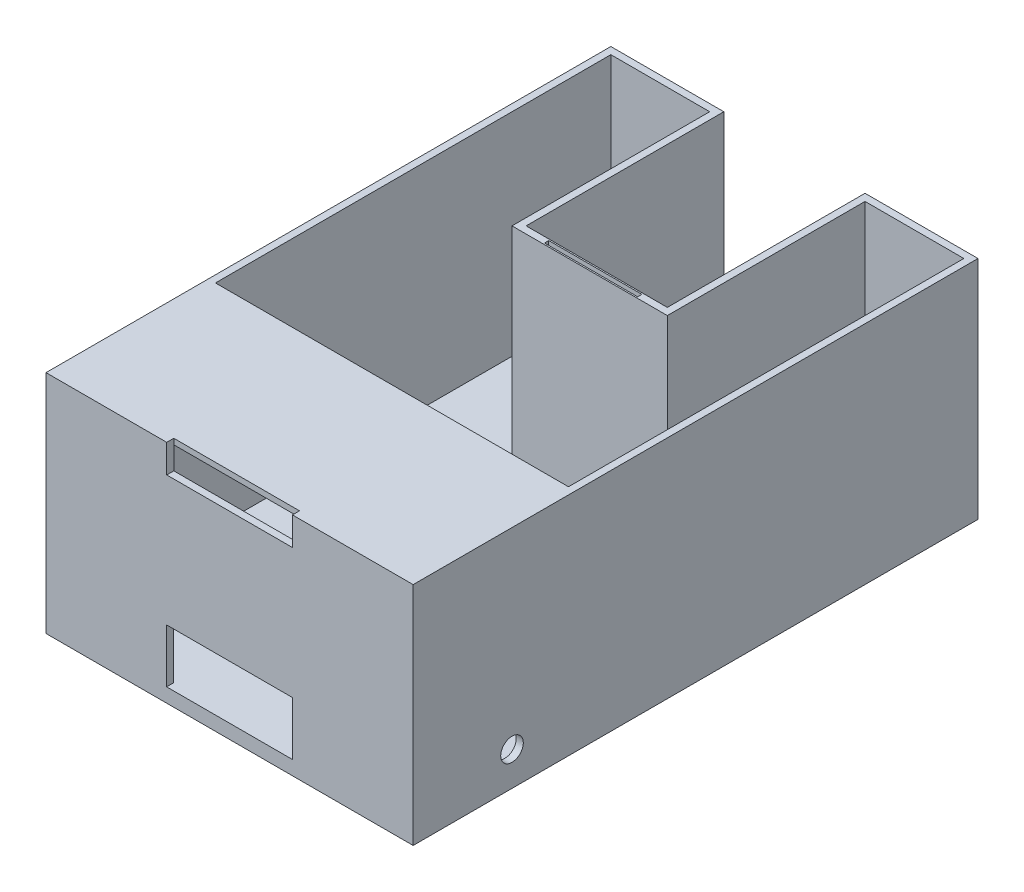
ISO-10303-21;
HEADER;
FILE_DESCRIPTION(('STEP AP214'),'2;1');
FILE_NAME('part.step','',(''),(''),'','','');
FILE_SCHEMA(('AUTOMOTIVE_DESIGN { 1 0 10303 214 1 1 1 1 }'));
ENDSEC;
DATA;
#1=APPLICATION_CONTEXT('core data for automotive mechanical design processes');
#2=APPLICATION_PROTOCOL_DEFINITION('international standard','automotive_design',2000,#1);
#3=PRODUCT_CONTEXT('',#1,'mechanical');
#4=PRODUCT('Part','Part','',(#3));
#5=PRODUCT_RELATED_PRODUCT_CATEGORY('part','',(#4));
#6=PRODUCT_DEFINITION_FORMATION('','',#4);
#7=PRODUCT_DEFINITION_CONTEXT('part definition',#1,'design');
#8=PRODUCT_DEFINITION('design','',#6,#7);
#9=PRODUCT_DEFINITION_SHAPE('','',#8);
#10=(LENGTH_UNIT() NAMED_UNIT(*) SI_UNIT(.MILLI.,.METRE.));
#11=(NAMED_UNIT(*) PLANE_ANGLE_UNIT() SI_UNIT($,.RADIAN.));
#12=(NAMED_UNIT(*) SI_UNIT($,.STERADIAN.) SOLID_ANGLE_UNIT());
#13=UNCERTAINTY_MEASURE_WITH_UNIT(LENGTH_MEASURE(1.E-05),#10,'distance_accuracy_value','');
#14=(GEOMETRIC_REPRESENTATION_CONTEXT(3) GLOBAL_UNCERTAINTY_ASSIGNED_CONTEXT((#13)) GLOBAL_UNIT_ASSIGNED_CONTEXT((#10,
#11,#12)) REPRESENTATION_CONTEXT('',''));
#15=CARTESIAN_POINT('',(0.,0.,0.));
#16=DIRECTION('',(0.,0.,1.));
#17=DIRECTION('',(1.,0.,0.));
#18=AXIS2_PLACEMENT_3D('',#15,#16,#17);
#19=CARTESIAN_POINT('',(-40.,80.,-130.));
#20=DIRECTION('',(0.,0.,-1.));
#21=DIRECTION('',(-1.,0.,0.));
#22=AXIS2_PLACEMENT_3D('',#19,#20,#21);
#23=PLANE('',#22);
#24=DIRECTION('',(0.,-1.,0.));
#25=VECTOR('',#24,1.);
#26=CARTESIAN_POINT('',(-90.,80.,-130.));
#27=LINE('',#26,#25);
#28=CARTESIAN_POINT('',(-90.,80.,-130.));
#29=VERTEX_POINT('',#28);
#30=CARTESIAN_POINT('',(-90.,-13.,-130.));
#31=VERTEX_POINT('',#30);
#32=EDGE_CURVE('E101',#29,#31,#27,.T.);
#33=ORIENTED_EDGE('',*,*,#32,.T.);
#34=DIRECTION('',(-1.,0.,0.));
#35=VECTOR('',#34,1.);
#36=CARTESIAN_POINT('',(-40.,-13.,-130.));
#37=LINE('',#36,#35);
#38=CARTESIAN_POINT('',(-40.,-13.,-130.));
#39=VERTEX_POINT('',#38);
#40=EDGE_CURVE('E12',#39,#31,#37,.T.);
#41=ORIENTED_EDGE('',*,*,#40,.F.);
#42=DIRECTION('',(0.,-1.,0.));
#43=VECTOR('',#42,1.);
#44=CARTESIAN_POINT('',(-40.,80.,-130.));
#45=LINE('',#44,#43);
#46=CARTESIAN_POINT('',(-40.,80.,-130.));
#47=VERTEX_POINT('',#46);
#48=EDGE_CURVE('E96',#47,#39,#45,.T.);
#49=ORIENTED_EDGE('',*,*,#48,.F.);
#50=DIRECTION('',(-1.,0.,0.));
#51=VECTOR('',#50,1.);
#52=CARTESIAN_POINT('',(-40.,80.,-130.));
#53=LINE('',#52,#51);
#54=EDGE_CURVE('E71',#47,#29,#53,.T.);
#55=ORIENTED_EDGE('',*,*,#54,.T.);
#56=EDGE_LOOP('',(#33,#41,#49,#55));
#57=FACE_BOUND('',#56,.T.);
#58=ADVANCED_FACE('F55',(#57),#23,.F.);
#59=CARTESIAN_POINT('',(-40.,-13.,-130.));
#60=DIRECTION('',(0.,1.,0.));
#61=DIRECTION('',(0.,0.,1.));
#62=AXIS2_PLACEMENT_3D('',#59,#60,#61);
#63=PLANE('',#62);
#64=DIRECTION('',(0.,0.,-1.));
#65=VECTOR('',#64,1.);
#66=CARTESIAN_POINT('',(-90.,-13.,-130.));
#67=LINE('',#66,#65);
#68=CARTESIAN_POINT('',(-90.,-13.,-205.609280570335));
#69=VERTEX_POINT('',#68);
#70=EDGE_CURVE('E104',#31,#69,#67,.T.);
#71=ORIENTED_EDGE('',*,*,#70,.T.);
#72=DIRECTION('',(-1.,0.,0.));
#73=VECTOR('',#72,1.);
#74=CARTESIAN_POINT('',(-40.,-13.,-205.609280570335));
#75=LINE('',#74,#73);
#76=CARTESIAN_POINT('',(-40.,-13.,-205.609280570335));
#77=VERTEX_POINT('',#76);
#78=EDGE_CURVE('E63',#77,#69,#75,.T.);
#79=ORIENTED_EDGE('',*,*,#78,.F.);
#80=DIRECTION('',(0.,0.,-1.));
#81=VECTOR('',#80,1.);
#82=CARTESIAN_POINT('',(-40.,-13.,-130.));
#83=LINE('',#82,#81);
#84=EDGE_CURVE('E89',#39,#77,#83,.T.);
#85=ORIENTED_EDGE('',*,*,#84,.F.);
#86=ORIENTED_EDGE('',*,*,#40,.T.);
#87=EDGE_LOOP('',(#71,#79,#85,#86));
#88=FACE_BOUND('',#87,.T.);
#89=ADVANCED_FACE('F91',(#88),#63,.F.);
#90=CARTESIAN_POINT('',(-40.,80.,-225.));
#91=DIRECTION('',(-1.,0.,0.));
#92=DIRECTION('',(0.,0.,1.));
#93=AXIS2_PLACEMENT_3D('',#90,#91,#92);
#94=CYLINDRICAL_SURFACE('',#93,95.);
#95=CARTESIAN_POINT('',(-90.,80.,-225.));
#96=DIRECTION('',(1.,0.,0.));
#97=DIRECTION('',(0.,0.,-1.));
#98=AXIS2_PLACEMENT_3D('',#95,#96,#97);
#99=CIRCLE('',#98,95.);
#100=EDGE_CURVE('E99',#29,#69,#99,.T.);
#101=ORIENTED_EDGE('',*,*,#100,.F.);
#102=ORIENTED_EDGE('',*,*,#54,.F.);
#103=CARTESIAN_POINT('',(-40.,80.,-225.));
#104=DIRECTION('',(1.,0.,0.));
#105=DIRECTION('',(0.,0.,-1.));
#106=AXIS2_PLACEMENT_3D('',#103,#104,#105);
#107=CIRCLE('',#106,95.);
#108=EDGE_CURVE('E95',#47,#77,#107,.T.);
#109=ORIENTED_EDGE('',*,*,#108,.T.);
#110=ORIENTED_EDGE('',*,*,#78,.T.);
#111=EDGE_LOOP('',(#101,#102,#109,#110));
#112=FACE_BOUND('',#111,.T.);
#113=ADVANCED_FACE('F110',(#112),#94,.F.);
#114=CARTESIAN_POINT('',(-40.,80.,-225.));
#115=DIRECTION('',(1.,0.,0.));
#116=DIRECTION('',(0.,0.,-1.));
#117=AXIS2_PLACEMENT_3D('',#114,#115,#116);
#118=PLANE('',#117);
#119=ORIENTED_EDGE('',*,*,#48,.T.);
#120=ORIENTED_EDGE('',*,*,#84,.T.);
#121=ORIENTED_EDGE('',*,*,#108,.F.);
#122=EDGE_LOOP('',(#119,#120,#121));
#123=FACE_BOUND('',#122,.T.);
#124=ADVANCED_FACE('F98',(#123),#118,.T.);
#125=CARTESIAN_POINT('',(-90.,80.,-225.));
#126=DIRECTION('',(1.,0.,0.));
#127=DIRECTION('',(0.,0.,-1.));
#128=AXIS2_PLACEMENT_3D('',#125,#126,#127);
#129=PLANE('',#128);
#130=ORIENTED_EDGE('',*,*,#32,.F.);
#131=ORIENTED_EDGE('',*,*,#100,.T.);
#132=ORIENTED_EDGE('',*,*,#70,.F.);
#133=EDGE_LOOP('',(#130,#131,#132));
#134=FACE_BOUND('',#133,.T.);
#135=ADVANCED_FACE('F117',(#134),#129,.F.);
#136=CLOSED_SHELL('',(#58,#89,#113,#124,#135));
#137=MANIFOLD_SOLID_BREP('B2',#136);
#138=CARTESIAN_POINT('',(-127.5,80.,-197.5));
#139=DIRECTION('',(1.,0.,0.));
#140=DIRECTION('',(0.,0.,-1.));
#141=AXIS2_PLACEMENT_3D('',#138,#139,#140);
#142=PLANE('',#141);
#143=CARTESIAN_POINT('',(-127.5,12.,-35.));
#144=DIRECTION('',(1.,0.,0.));
#145=DIRECTION('',(0.,0.,-1.));
#146=AXIS2_PLACEMENT_3D('',#143,#144,#145);
#147=CIRCLE('',#146,4.00000000000001);
#148=CARTESIAN_POINT('',(-127.5,12.,-39.));
#149=VERTEX_POINT('',#148);
#150=EDGE_CURVE('E404',#149,#149,#147,.T.);
#151=ORIENTED_EDGE('',*,*,#150,.F.);
#152=EDGE_LOOP('',(#151));
#153=FACE_BOUND('',#152,.T.);
#154=DIRECTION('',(0.,-1.,0.));
#155=VECTOR('',#154,1.);
#156=CARTESIAN_POINT('',(-127.5,80.,-57.5));
#157=LINE('',#156,#155);
#158=CARTESIAN_POINT('',(-127.5,80.,-57.5));
#159=VERTEX_POINT('',#158);
#160=CARTESIAN_POINT('',(-127.5,78.,-57.5));
#161=VERTEX_POINT('',#160);
#162=EDGE_CURVE('E449',#159,#161,#157,.T.);
#163=ORIENTED_EDGE('',*,*,#162,.T.);
#164=DIRECTION('',(0.,0.,1.));
#165=VECTOR('',#164,1.);
#166=CARTESIAN_POINT('',(-127.5,78.,-197.5));
#167=LINE('',#166,#165);
#168=CARTESIAN_POINT('',(-127.5,78.,-2.50000000000001));
#169=VERTEX_POINT('',#168);
#170=EDGE_CURVE('E452',#161,#169,#167,.T.);
#171=ORIENTED_EDGE('',*,*,#170,.T.);
#172=DIRECTION('',(0.,-1.,0.));
#173=VECTOR('',#172,1.);
#174=CARTESIAN_POINT('',(-127.5,80.,-2.5));
#175=LINE('',#174,#173);
#176=CARTESIAN_POINT('',(-127.5,5.,-2.5));
#177=VERTEX_POINT('',#176);
#178=EDGE_CURVE('E525',#169,#177,#175,.T.);
#179=ORIENTED_EDGE('',*,*,#178,.T.);
#180=DIRECTION('',(0.,0.,1.));
#181=VECTOR('',#180,1.);
#182=CARTESIAN_POINT('',(-127.5,5.,-197.5));
#183=LINE('',#182,#181);
#184=CARTESIAN_POINT('',(-127.5,5.,-197.5));
#185=VERTEX_POINT('',#184);
#186=EDGE_CURVE('E497',#185,#177,#183,.T.);
#187=ORIENTED_EDGE('',*,*,#186,.F.);
#188=DIRECTION('',(0.,-1.,0.));
#189=VECTOR('',#188,1.);
#190=CARTESIAN_POINT('',(-127.5,80.,-197.5));
#191=LINE('',#190,#189);
#192=CARTESIAN_POINT('',(-127.5,80.,-197.5));
#193=VERTEX_POINT('',#192);
#194=EDGE_CURVE('E527',#193,#185,#191,.T.);
#195=ORIENTED_EDGE('',*,*,#194,.F.);
#196=DIRECTION('',(0.,0.,1.));
#197=VECTOR('',#196,1.);
#198=CARTESIAN_POINT('',(-127.5,80.,-197.5));
#199=LINE('',#198,#197);
#200=EDGE_CURVE('E479',#193,#159,#199,.T.);
#201=ORIENTED_EDGE('',*,*,#200,.T.);
#202=EDGE_LOOP('',(#163,#171,#179,#187,#195,#201));
#203=FACE_BOUND('',#202,.T.);
#204=ADVANCED_FACE('F153',(#153,#203),#142,.T.);
#205=CARTESIAN_POINT('',(-127.5,80.,-2.5));
#206=DIRECTION('',(0.,0.,-1.));
#207=DIRECTION('',(-1.,0.,0.));
#208=AXIS2_PLACEMENT_3D('',#205,#206,#207);
#209=PLANE('',#208);
#210=DIRECTION('',(0.,1.,0.));
#211=VECTOR('',#210,1.);
#212=CARTESIAN_POINT('',(-42.7,24.,-2.5));
#213=LINE('',#212,#211);
#214=CARTESIAN_POINT('',(-42.7,5.,-2.50000000000001));
#215=VERTEX_POINT('',#214);
#216=CARTESIAN_POINT('',(-42.7,24.,-2.5));
#217=VERTEX_POINT('',#216);
#218=EDGE_CURVE('E424',#215,#217,#213,.T.);
#219=ORIENTED_EDGE('',*,*,#218,.T.);
#220=DIRECTION('',(-1.,0.,0.));
#221=VECTOR('',#220,1.);
#222=CARTESIAN_POINT('',(-87.3,24.,-2.5));
#223=LINE('',#222,#221);
#224=CARTESIAN_POINT('',(-87.3,24.,-2.5));
#225=VERTEX_POINT('',#224);
#226=EDGE_CURVE('E407',#217,#225,#223,.T.);
#227=ORIENTED_EDGE('',*,*,#226,.T.);
#228=DIRECTION('',(0.,-1.,0.));
#229=VECTOR('',#228,1.);
#230=CARTESIAN_POINT('',(-87.3,5.,-2.5));
#231=LINE('',#230,#229);
#232=CARTESIAN_POINT('',(-87.3,5.,-2.50000000000006));
#233=VERTEX_POINT('',#232);
#234=EDGE_CURVE('E408',#225,#233,#231,.T.);
#235=ORIENTED_EDGE('',*,*,#234,.T.);
#236=DIRECTION('',(1.,0.,0.));
#237=VECTOR('',#236,1.);
#238=CARTESIAN_POINT('',(-127.5,5.,-2.5));
#239=LINE('',#238,#237);
#240=EDGE_CURVE('E501',#177,#233,#239,.T.);
#241=ORIENTED_EDGE('',*,*,#240,.F.);
#242=ORIENTED_EDGE('',*,*,#178,.F.);
#243=DIRECTION('',(-1.,0.,0.));
#244=VECTOR('',#243,1.);
#245=CARTESIAN_POINT('',(-130.,78.,-2.50000000000001));
#246=LINE('',#245,#244);
#247=CARTESIAN_POINT('',(-87.25,78.,-2.50000000000001));
#248=VERTEX_POINT('',#247);
#249=EDGE_CURVE('E416',#248,#169,#246,.T.);
#250=ORIENTED_EDGE('',*,*,#249,.F.);
#251=DIRECTION('',(0.,1.,0.));
#252=VECTOR('',#251,1.);
#253=CARTESIAN_POINT('',(-87.25,80.,-2.5));
#254=LINE('',#253,#252);
#255=CARTESIAN_POINT('',(-87.25,70.,-2.5));
#256=VERTEX_POINT('',#255);
#257=EDGE_CURVE('E603',#256,#248,#254,.T.);
#258=ORIENTED_EDGE('',*,*,#257,.F.);
#259=DIRECTION('',(1.,0.,0.));
#260=VECTOR('',#259,1.);
#261=CARTESIAN_POINT('',(-127.5,70.,-2.5));
#262=LINE('',#261,#260);
#263=CARTESIAN_POINT('',(-42.75,70.,-2.50000000000001));
#264=VERTEX_POINT('',#263);
#265=EDGE_CURVE('E596',#256,#264,#262,.T.);
#266=ORIENTED_EDGE('',*,*,#265,.T.);
#267=DIRECTION('',(0.,-1.,0.));
#268=VECTOR('',#267,1.);
#269=CARTESIAN_POINT('',(-42.75,80.,-2.50000000000001));
#270=LINE('',#269,#268);
#271=CARTESIAN_POINT('',(-42.75,78.,-2.50000000000001));
#272=VERTEX_POINT('',#271);
#273=EDGE_CURVE('E599',#272,#264,#270,.T.);
#274=ORIENTED_EDGE('',*,*,#273,.F.);
#275=CARTESIAN_POINT('',(-2.5,78.,-2.50000000000001));
#276=VERTEX_POINT('',#275);
#277=EDGE_CURVE('E444',#276,#272,#246,.T.);
#278=ORIENTED_EDGE('',*,*,#277,.F.);
#279=DIRECTION('',(0.,-1.,0.));
#280=VECTOR('',#279,1.);
#281=CARTESIAN_POINT('',(-2.5,80.,-2.50000000000001));
#282=LINE('',#281,#280);
#283=CARTESIAN_POINT('',(-2.5,5.,-2.50000000000001));
#284=VERTEX_POINT('',#283);
#285=EDGE_CURVE('E522',#276,#284,#282,.T.);
#286=ORIENTED_EDGE('',*,*,#285,.T.);
#287=EDGE_CURVE('E500',#215,#284,#239,.T.);
#288=ORIENTED_EDGE('',*,*,#287,.F.);
#289=EDGE_LOOP('',(#219,#227,#235,#241,#242,#250,#258,#266,#274,#278,#286,#288));
#290=FACE_BOUND('',#289,.T.);
#291=ADVANCED_FACE('F635',(#290),#209,.T.);
#292=CARTESIAN_POINT('',(-2.5,80.,-2.50000000000001));
#293=DIRECTION('',(-1.,0.,0.));
#294=DIRECTION('',(0.,0.,1.));
#295=AXIS2_PLACEMENT_3D('',#292,#293,#294);
#296=PLANE('',#295);
#297=CARTESIAN_POINT('',(-2.5,12.,-35.));
#298=DIRECTION('',(-1.,0.,0.));
#299=DIRECTION('',(0.,0.,1.));
#300=AXIS2_PLACEMENT_3D('',#297,#298,#299);
#301=CIRCLE('',#300,4.00000000000001);
#302=CARTESIAN_POINT('',(-2.5,12.,-31.));
#303=VERTEX_POINT('',#302);
#304=EDGE_CURVE('E399',#303,#303,#301,.T.);
#305=ORIENTED_EDGE('',*,*,#304,.F.);
#306=EDGE_LOOP('',(#305));
#307=FACE_BOUND('',#306,.T.);
#308=ORIENTED_EDGE('',*,*,#285,.F.);
#309=DIRECTION('',(0.,0.,-1.));
#310=VECTOR('',#309,1.);
#311=CARTESIAN_POINT('',(-2.5,78.,-2.50000000000001));
#312=LINE('',#311,#310);
#313=CARTESIAN_POINT('',(-2.5,78.,-57.5));
#314=VERTEX_POINT('',#313);
#315=EDGE_CURVE('E53',#276,#314,#312,.T.);
#316=ORIENTED_EDGE('',*,*,#315,.T.);
#317=DIRECTION('',(0.,1.,0.));
#318=VECTOR('',#317,1.);
#319=CARTESIAN_POINT('',(-2.5,80.,-57.5));
#320=LINE('',#319,#318);
#321=CARTESIAN_POINT('',(-2.5,80.,-57.5));
#322=VERTEX_POINT('',#321);
#323=EDGE_CURVE('E161',#314,#322,#320,.T.);
#324=ORIENTED_EDGE('',*,*,#323,.T.);
#325=DIRECTION('',(0.,0.,-1.));
#326=VECTOR('',#325,1.);
#327=CARTESIAN_POINT('',(-2.5,80.,-2.50000000000001));
#328=LINE('',#327,#326);
#329=CARTESIAN_POINT('',(-2.5,80.,-197.5));
#330=VERTEX_POINT('',#329);
#331=EDGE_CURVE('E482',#322,#330,#328,.T.);
#332=ORIENTED_EDGE('',*,*,#331,.T.);
#333=DIRECTION('',(0.,-1.,0.));
#334=VECTOR('',#333,1.);
#335=CARTESIAN_POINT('',(-2.5,80.,-197.5));
#336=LINE('',#335,#334);
#337=CARTESIAN_POINT('',(-2.5,5.,-197.5));
#338=VERTEX_POINT('',#337);
#339=EDGE_CURVE('E520',#330,#338,#336,.T.);
#340=ORIENTED_EDGE('',*,*,#339,.T.);
#341=DIRECTION('',(0.,0.,-1.));
#342=VECTOR('',#341,1.);
#343=CARTESIAN_POINT('',(-2.5,5.,-2.50000000000001));
#344=LINE('',#343,#342);
#345=EDGE_CURVE('E504',#284,#338,#344,.T.);
#346=ORIENTED_EDGE('',*,*,#345,.F.);
#347=EDGE_LOOP('',(#308,#316,#324,#332,#340,#346));
#348=FACE_BOUND('',#347,.T.);
#349=ADVANCED_FACE('F609',(#307,#348),#296,.T.);
#350=CARTESIAN_POINT('',(-130.,5.,0.));
#351=DIRECTION('',(1.,0.,0.));
#352=DIRECTION('',(0.,0.,-1.));
#353=AXIS2_PLACEMENT_3D('',#350,#351,#352);
#354=PLANE('',#353);
#355=CARTESIAN_POINT('',(-130.,12.,-35.));
#356=DIRECTION('',(-1.,0.,0.));
#357=DIRECTION('',(0.,0.,1.));
#358=AXIS2_PLACEMENT_3D('',#355,#356,#357);
#359=CIRCLE('',#358,4.00000000000001);
#360=CARTESIAN_POINT('',(-130.,12.,-31.));
#361=VERTEX_POINT('',#360);
#362=EDGE_CURVE('E392',#361,#361,#359,.T.);
#363=ORIENTED_EDGE('',*,*,#362,.F.);
#364=EDGE_LOOP('',(#363));
#365=FACE_BOUND('',#364,.T.);
#366=DIRECTION('',(0.,-1.,0.));
#367=VECTOR('',#366,1.);
#368=CARTESIAN_POINT('',(-130.,5.,0.));
#369=LINE('',#368,#367);
#370=CARTESIAN_POINT('',(-130.,80.,0.));
#371=VERTEX_POINT('',#370);
#372=CARTESIAN_POINT('',(-130.,0.,0.));
#373=VERTEX_POINT('',#372);
#374=EDGE_CURVE('E593',#371,#373,#369,.T.);
#375=ORIENTED_EDGE('',*,*,#374,.F.);
#376=DIRECTION('',(0.,0.,1.));
#377=VECTOR('',#376,1.);
#378=CARTESIAN_POINT('',(-130.,80.,-200.));
#379=LINE('',#378,#377);
#380=CARTESIAN_POINT('',(-130.,80.,-200.));
#381=VERTEX_POINT('',#380);
#382=EDGE_CURVE('E532',#381,#371,#379,.T.);
#383=ORIENTED_EDGE('',*,*,#382,.F.);
#384=DIRECTION('',(0.,-1.,0.));
#385=VECTOR('',#384,1.);
#386=CARTESIAN_POINT('',(-130.,5.,-200.));
#387=LINE('',#386,#385);
#388=CARTESIAN_POINT('',(-130.,0.,-200.));
#389=VERTEX_POINT('',#388);
#390=EDGE_CURVE('E572',#381,#389,#387,.T.);
#391=ORIENTED_EDGE('',*,*,#390,.T.);
#392=DIRECTION('',(0.,0.,1.));
#393=VECTOR('',#392,1.);
#394=CARTESIAN_POINT('',(-130.,0.,0.));
#395=LINE('',#394,#393);
#396=EDGE_CURVE('E555',#389,#373,#395,.T.);
#397=ORIENTED_EDGE('',*,*,#396,.T.);
#398=EDGE_LOOP('',(#375,#383,#391,#397));
#399=FACE_BOUND('',#398,.T.);
#400=ADVANCED_FACE('F155',(#365,#399),#354,.F.);
#401=CARTESIAN_POINT('',(-130.,5.,0.));
#402=DIRECTION('',(0.,0.,-1.));
#403=DIRECTION('',(-1.,0.,0.));
#404=AXIS2_PLACEMENT_3D('',#401,#402,#403);
#405=PLANE('',#404);
#406=DIRECTION('',(0.,-1.,0.));
#407=VECTOR('',#406,1.);
#408=CARTESIAN_POINT('',(-87.3,5.,0.));
#409=LINE('',#408,#407);
#410=CARTESIAN_POINT('',(-87.3,24.,0.));
#411=VERTEX_POINT('',#410);
#412=CARTESIAN_POINT('',(-87.3,5.,0.));
#413=VERTEX_POINT('',#412);
#414=EDGE_CURVE('E420',#411,#413,#409,.T.);
#415=ORIENTED_EDGE('',*,*,#414,.F.);
#416=DIRECTION('',(-1.,0.,0.));
#417=VECTOR('',#416,1.);
#418=CARTESIAN_POINT('',(-87.3,24.,0.));
#419=LINE('',#418,#417);
#420=CARTESIAN_POINT('',(-42.7,24.,0.));
#421=VERTEX_POINT('',#420);
#422=EDGE_CURVE('E176',#421,#411,#419,.T.);
#423=ORIENTED_EDGE('',*,*,#422,.F.);
#424=DIRECTION('',(0.,1.,0.));
#425=VECTOR('',#424,1.);
#426=CARTESIAN_POINT('',(-42.7,24.,0.));
#427=LINE('',#426,#425);
#428=CARTESIAN_POINT('',(-42.7,5.,0.));
#429=VERTEX_POINT('',#428);
#430=EDGE_CURVE('E413',#429,#421,#427,.T.);
#431=ORIENTED_EDGE('',*,*,#430,.F.);
#432=DIRECTION('',(1.,0.,0.));
#433=VECTOR('',#432,1.);
#434=CARTESIAN_POINT('',(-87.3,5.,0.));
#435=LINE('',#434,#433);
#436=EDGE_CURVE('E417',#413,#429,#435,.T.);
#437=ORIENTED_EDGE('',*,*,#436,.F.);
#438=EDGE_LOOP('',(#415,#423,#431,#437));
#439=FACE_BOUND('',#438,.T.);
#440=DIRECTION('',(1.,0.,0.));
#441=VECTOR('',#440,1.);
#442=CARTESIAN_POINT('',(-65.,70.,0.));
#443=LINE('',#442,#441);
#444=CARTESIAN_POINT('',(-87.25,70.,0.));
#445=VERTEX_POINT('',#444);
#446=CARTESIAN_POINT('',(-42.75,70.,0.));
#447=VERTEX_POINT('',#446);
#448=EDGE_CURVE('E456',#445,#447,#443,.T.);
#449=ORIENTED_EDGE('',*,*,#448,.F.);
#450=DIRECTION('',(0.,1.,0.));
#451=VECTOR('',#450,1.);
#452=CARTESIAN_POINT('',(-87.25,70.,0.));
#453=LINE('',#452,#451);
#454=CARTESIAN_POINT('',(-87.25,80.,0.));
#455=VERTEX_POINT('',#454);
#456=EDGE_CURVE('E469',#445,#455,#453,.T.);
#457=ORIENTED_EDGE('',*,*,#456,.T.);
#458=DIRECTION('',(1.,0.,0.));
#459=VECTOR('',#458,1.);
#460=CARTESIAN_POINT('',(-130.,80.,0.));
#461=LINE('',#460,#459);
#462=EDGE_CURVE('E535',#371,#455,#461,.T.);
#463=ORIENTED_EDGE('',*,*,#462,.F.);
#464=ORIENTED_EDGE('',*,*,#374,.T.);
#465=DIRECTION('',(1.,0.,0.));
#466=VECTOR('',#465,1.);
#467=CARTESIAN_POINT('',(-130.,0.,0.));
#468=LINE('',#467,#466);
#469=CARTESIAN_POINT('',(0.,0.,0.));
#470=VERTEX_POINT('',#469);
#471=EDGE_CURVE('E558',#373,#470,#468,.T.);
#472=ORIENTED_EDGE('',*,*,#471,.T.);
#473=DIRECTION('',(0.,-1.,0.));
#474=VECTOR('',#473,1.);
#475=CARTESIAN_POINT('',(0.,5.,0.));
#476=LINE('',#475,#474);
#477=CARTESIAN_POINT('',(0.,80.,0.));
#478=VERTEX_POINT('',#477);
#479=EDGE_CURVE('E590',#478,#470,#476,.T.);
#480=ORIENTED_EDGE('',*,*,#479,.F.);
#481=CARTESIAN_POINT('',(-42.75,80.,0.));
#482=VERTEX_POINT('',#481);
#483=EDGE_CURVE('E534',#482,#478,#461,.T.);
#484=ORIENTED_EDGE('',*,*,#483,.F.);
#485=DIRECTION('',(0.,1.,0.));
#486=VECTOR('',#485,1.);
#487=CARTESIAN_POINT('',(-42.75,70.,0.));
#488=LINE('',#487,#486);
#489=EDGE_CURVE('E465',#447,#482,#488,.T.);
#490=ORIENTED_EDGE('',*,*,#489,.F.);
#491=EDGE_LOOP('',(#449,#457,#463,#464,#472,#480,#484,#490));
#492=FACE_BOUND('',#491,.T.);
#493=ADVANCED_FACE('F662',(#439,#492),#405,.F.);
#494=CARTESIAN_POINT('',(0.,5.,0.));
#495=DIRECTION('',(-1.,0.,0.));
#496=DIRECTION('',(0.,0.,1.));
#497=AXIS2_PLACEMENT_3D('',#494,#495,#496);
#498=PLANE('',#497);
#499=CARTESIAN_POINT('',(0.,12.,-35.));
#500=DIRECTION('',(-1.,0.,0.));
#501=DIRECTION('',(0.,0.,1.));
#502=AXIS2_PLACEMENT_3D('',#499,#500,#501);
#503=CIRCLE('',#502,4.00000000000001);
#504=CARTESIAN_POINT('',(0.,12.,-31.));
#505=VERTEX_POINT('',#504);
#506=EDGE_CURVE('E396',#505,#505,#503,.T.);
#507=ORIENTED_EDGE('',*,*,#506,.T.);
#508=EDGE_LOOP('',(#507));
#509=FACE_BOUND('',#508,.T.);
#510=DIRECTION('',(0.,-1.,0.));
#511=VECTOR('',#510,1.);
#512=CARTESIAN_POINT('',(0.,5.,-200.));
#513=LINE('',#512,#511);
#514=CARTESIAN_POINT('',(0.,80.,-200.));
#515=VERTEX_POINT('',#514);
#516=CARTESIAN_POINT('',(0.,0.,-200.));
#517=VERTEX_POINT('',#516);
#518=EDGE_CURVE('E587',#515,#517,#513,.T.);
#519=ORIENTED_EDGE('',*,*,#518,.F.);
#520=DIRECTION('',(0.,0.,-1.));
#521=VECTOR('',#520,1.);
#522=CARTESIAN_POINT('',(0.,80.,0.));
#523=LINE('',#522,#521);
#524=EDGE_CURVE('E538',#478,#515,#523,.T.);
#525=ORIENTED_EDGE('',*,*,#524,.F.);
#526=ORIENTED_EDGE('',*,*,#479,.T.);
#527=DIRECTION('',(0.,0.,-1.));
#528=VECTOR('',#527,1.);
#529=CARTESIAN_POINT('',(0.,0.,0.));
#530=LINE('',#529,#528);
#531=EDGE_CURVE('E560',#470,#517,#530,.T.);
#532=ORIENTED_EDGE('',*,*,#531,.T.);
#533=EDGE_LOOP('',(#519,#525,#526,#532));
#534=FACE_BOUND('',#533,.T.);
#535=ADVANCED_FACE('F669',(#509,#534),#498,.F.);
#536=CARTESIAN_POINT('',(-40.,5.,-200.));
#537=DIRECTION('',(0.,0.,1.));
#538=DIRECTION('',(1.,0.,0.));
#539=AXIS2_PLACEMENT_3D('',#536,#537,#538);
#540=PLANE('',#539);
#541=DIRECTION('',(-1.,0.,0.));
#542=VECTOR('',#541,1.);
#543=CARTESIAN_POINT('',(-40.,0.,-200.));
#544=LINE('',#543,#542);
#545=CARTESIAN_POINT('',(-40.,0.,-200.));
#546=VERTEX_POINT('',#545);
#547=EDGE_CURVE('E562',#517,#546,#544,.T.);
#548=ORIENTED_EDGE('',*,*,#547,.T.);
#549=DIRECTION('',(0.,-1.,0.));
#550=VECTOR('',#549,1.);
#551=CARTESIAN_POINT('',(-40.,5.,-200.));
#552=LINE('',#551,#550);
#553=CARTESIAN_POINT('',(-40.,80.,-200.));
#554=VERTEX_POINT('',#553);
#555=EDGE_CURVE('E584',#554,#546,#552,.T.);
#556=ORIENTED_EDGE('',*,*,#555,.F.);
#557=DIRECTION('',(-1.,0.,0.));
#558=VECTOR('',#557,1.);
#559=CARTESIAN_POINT('',(0.,80.,-200.));
#560=LINE('',#559,#558);
#561=EDGE_CURVE('E540',#515,#554,#560,.T.);
#562=ORIENTED_EDGE('',*,*,#561,.F.);
#563=ORIENTED_EDGE('',*,*,#518,.T.);
#564=EDGE_LOOP('',(#548,#556,#562,#563));
#565=FACE_BOUND('',#564,.T.);
#566=ADVANCED_FACE('F673',(#565),#540,.F.);
#567=CARTESIAN_POINT('',(-40.,5.,-130.));
#568=DIRECTION('',(1.,0.,0.));
#569=DIRECTION('',(0.,0.,-1.));
#570=AXIS2_PLACEMENT_3D('',#567,#568,#569);
#571=PLANE('',#570);
#572=DIRECTION('',(0.,0.,1.));
#573=VECTOR('',#572,1.);
#574=CARTESIAN_POINT('',(-40.,0.,-130.));
#575=LINE('',#574,#573);
#576=CARTESIAN_POINT('',(-40.,0.,-130.));
#577=VERTEX_POINT('',#576);
#578=EDGE_CURVE('E564',#546,#577,#575,.T.);
#579=ORIENTED_EDGE('',*,*,#578,.T.);
#580=DIRECTION('',(0.,-1.,0.));
#581=VECTOR('',#580,1.);
#582=CARTESIAN_POINT('',(-40.,5.,-130.));
#583=LINE('',#582,#581);
#584=CARTESIAN_POINT('',(-40.,80.,-130.));
#585=VERTEX_POINT('',#584);
#586=EDGE_CURVE('E581',#585,#577,#583,.T.);
#587=ORIENTED_EDGE('',*,*,#586,.F.);
#588=DIRECTION('',(0.,0.,1.));
#589=VECTOR('',#588,1.);
#590=CARTESIAN_POINT('',(-40.,80.,-200.));
#591=LINE('',#590,#589);
#592=EDGE_CURVE('E543',#554,#585,#591,.T.);
#593=ORIENTED_EDGE('',*,*,#592,.F.);
#594=ORIENTED_EDGE('',*,*,#555,.T.);
#595=EDGE_LOOP('',(#579,#587,#593,#594));
#596=FACE_BOUND('',#595,.T.);
#597=ADVANCED_FACE('F676',(#596),#571,.F.);
#598=CARTESIAN_POINT('',(-90.,5.,-130.));
#599=DIRECTION('',(0.,0.,1.));
#600=DIRECTION('',(1.,0.,0.));
#601=AXIS2_PLACEMENT_3D('',#598,#599,#600);
#602=PLANE('',#601);
#603=DIRECTION('',(-1.,0.,0.));
#604=VECTOR('',#603,1.);
#605=CARTESIAN_POINT('',(-90.,0.,-130.));
#606=LINE('',#605,#604);
#607=CARTESIAN_POINT('',(-90.,0.,-130.));
#608=VERTEX_POINT('',#607);
#609=EDGE_CURVE('E566',#577,#608,#606,.T.);
#610=ORIENTED_EDGE('',*,*,#609,.T.);
#611=DIRECTION('',(0.,-1.,0.));
#612=VECTOR('',#611,1.);
#613=CARTESIAN_POINT('',(-90.,5.,-130.));
#614=LINE('',#613,#612);
#615=CARTESIAN_POINT('',(-90.,80.,-130.));
#616=VERTEX_POINT('',#615);
#617=EDGE_CURVE('E578',#616,#608,#614,.T.);
#618=ORIENTED_EDGE('',*,*,#617,.F.);
#619=DIRECTION('',(-1.,0.,0.));
#620=VECTOR('',#619,1.);
#621=CARTESIAN_POINT('',(-40.,80.,-130.));
#622=LINE('',#621,#620);
#623=EDGE_CURVE('E546',#585,#616,#622,.T.);
#624=ORIENTED_EDGE('',*,*,#623,.F.);
#625=ORIENTED_EDGE('',*,*,#586,.T.);
#626=EDGE_LOOP('',(#610,#618,#624,#625));
#627=FACE_BOUND('',#626,.T.);
#628=ADVANCED_FACE('F684',(#627),#602,.F.);
#629=CARTESIAN_POINT('',(-90.,5.,-200.));
#630=DIRECTION('',(-1.,0.,0.));
#631=DIRECTION('',(0.,0.,1.));
#632=AXIS2_PLACEMENT_3D('',#629,#630,#631);
#633=PLANE('',#632);
#634=DIRECTION('',(0.,0.,-1.));
#635=VECTOR('',#634,1.);
#636=CARTESIAN_POINT('',(-90.,0.,-200.));
#637=LINE('',#636,#635);
#638=CARTESIAN_POINT('',(-90.,0.,-200.));
#639=VERTEX_POINT('',#638);
#640=EDGE_CURVE('E568',#608,#639,#637,.T.);
#641=ORIENTED_EDGE('',*,*,#640,.T.);
#642=DIRECTION('',(0.,-1.,0.));
#643=VECTOR('',#642,1.);
#644=CARTESIAN_POINT('',(-90.,5.,-200.));
#645=LINE('',#644,#643);
#646=CARTESIAN_POINT('',(-90.,80.,-200.));
#647=VERTEX_POINT('',#646);
#648=EDGE_CURVE('E575',#647,#639,#645,.T.);
#649=ORIENTED_EDGE('',*,*,#648,.F.);
#650=DIRECTION('',(0.,0.,-1.));
#651=VECTOR('',#650,1.);
#652=CARTESIAN_POINT('',(-90.,80.,-130.));
#653=LINE('',#652,#651);
#654=EDGE_CURVE('E549',#616,#647,#653,.T.);
#655=ORIENTED_EDGE('',*,*,#654,.F.);
#656=ORIENTED_EDGE('',*,*,#617,.T.);
#657=EDGE_LOOP('',(#641,#649,#655,#656));
#658=FACE_BOUND('',#657,.T.);
#659=ADVANCED_FACE('F688',(#658),#633,.F.);
#660=CARTESIAN_POINT('',(-130.,5.,-200.));
#661=DIRECTION('',(0.,0.,1.));
#662=DIRECTION('',(1.,0.,0.));
#663=AXIS2_PLACEMENT_3D('',#660,#661,#662);
#664=PLANE('',#663);
#665=DIRECTION('',(-1.,0.,0.));
#666=VECTOR('',#665,1.);
#667=CARTESIAN_POINT('',(-130.,0.,-200.));
#668=LINE('',#667,#666);
#669=EDGE_CURVE('E570',#639,#389,#668,.T.);
#670=ORIENTED_EDGE('',*,*,#669,.T.);
#671=ORIENTED_EDGE('',*,*,#390,.F.);
#672=DIRECTION('',(-1.,0.,0.));
#673=VECTOR('',#672,1.);
#674=CARTESIAN_POINT('',(-90.,80.,-200.));
#675=LINE('',#674,#673);
#676=EDGE_CURVE('E552',#647,#381,#675,.T.);
#677=ORIENTED_EDGE('',*,*,#676,.F.);
#678=ORIENTED_EDGE('',*,*,#648,.T.);
#679=EDGE_LOOP('',(#670,#671,#677,#678));
#680=FACE_BOUND('',#679,.T.);
#681=ADVANCED_FACE('F692',(#680),#664,.F.);
#682=CARTESIAN_POINT('',(0.,0.,0.));
#683=DIRECTION('',(0.,-1.,0.));
#684=DIRECTION('',(0.,0.,-1.));
#685=AXIS2_PLACEMENT_3D('',#682,#683,#684);
#686=PLANE('',#685);
#687=ORIENTED_EDGE('',*,*,#396,.F.);
#688=ORIENTED_EDGE('',*,*,#669,.F.);
#689=ORIENTED_EDGE('',*,*,#640,.F.);
#690=ORIENTED_EDGE('',*,*,#609,.F.);
#691=ORIENTED_EDGE('',*,*,#578,.F.);
#692=ORIENTED_EDGE('',*,*,#547,.F.);
#693=ORIENTED_EDGE('',*,*,#531,.F.);
#694=ORIENTED_EDGE('',*,*,#471,.F.);
#695=EDGE_LOOP('',(#687,#688,#689,#690,#691,#692,#693,#694));
#696=FACE_BOUND('',#695,.T.);
#697=ADVANCED_FACE('F680',(#696),#686,.T.);
#698=CARTESIAN_POINT('',(0.,80.,0.));
#699=DIRECTION('',(0.,1.,0.));
#700=DIRECTION('',(0.,0.,1.));
#701=AXIS2_PLACEMENT_3D('',#698,#699,#700);
#702=PLANE('',#701);
#703=DIRECTION('',(1.,0.,0.));
#704=VECTOR('',#703,1.);
#705=CARTESIAN_POINT('',(-81.5,80.,-128.));
#706=LINE('',#705,#704);
#707=CARTESIAN_POINT('',(-81.5,80.,-128.));
#708=VERTEX_POINT('',#707);
#709=CARTESIAN_POINT('',(-48.5,80.,-128.));
#710=VERTEX_POINT('',#709);
#711=EDGE_CURVE('E168',#708,#710,#706,.T.);
#712=ORIENTED_EDGE('',*,*,#711,.F.);
#713=DIRECTION('',(0.,0.,1.));
#714=VECTOR('',#713,1.);
#715=CARTESIAN_POINT('',(-81.5,80.,-129.5));
#716=LINE('',#715,#714);
#717=CARTESIAN_POINT('',(-81.5,80.,-129.5));
#718=VERTEX_POINT('',#717);
#719=EDGE_CURVE('E377',#718,#708,#716,.T.);
#720=ORIENTED_EDGE('',*,*,#719,.F.);
#721=DIRECTION('',(1.,0.,0.));
#722=VECTOR('',#721,1.);
#723=CARTESIAN_POINT('',(-81.5,80.,-129.5));
#724=LINE('',#723,#722);
#725=CARTESIAN_POINT('',(-48.5,80.,-129.5));
#726=VERTEX_POINT('',#725);
#727=EDGE_CURVE('E380',#718,#726,#724,.T.);
#728=ORIENTED_EDGE('',*,*,#727,.T.);
#729=DIRECTION('',(0.,0.,-1.));
#730=VECTOR('',#729,1.);
#731=CARTESIAN_POINT('',(-48.5,80.,-128.));
#732=LINE('',#731,#730);
#733=EDGE_CURVE('E386',#710,#726,#732,.T.);
#734=ORIENTED_EDGE('',*,*,#733,.F.);
#735=EDGE_LOOP('',(#712,#720,#728,#734));
#736=FACE_BOUND('',#735,.T.);
#737=DIRECTION('',(1.,0.,0.));
#738=VECTOR('',#737,1.);
#739=CARTESIAN_POINT('',(0.,80.,-57.5));
#740=LINE('',#739,#738);
#741=EDGE_CURVE('E438',#159,#322,#740,.T.);
#742=ORIENTED_EDGE('',*,*,#741,.F.);
#743=ORIENTED_EDGE('',*,*,#200,.F.);
#744=DIRECTION('',(-1.,0.,0.));
#745=VECTOR('',#744,1.);
#746=CARTESIAN_POINT('',(-92.5,80.,-197.5));
#747=LINE('',#746,#745);
#748=CARTESIAN_POINT('',(-92.5,80.,-197.5));
#749=VERTEX_POINT('',#748);
#750=EDGE_CURVE('E476',#749,#193,#747,.T.);
#751=ORIENTED_EDGE('',*,*,#750,.F.);
#752=DIRECTION('',(0.,0.,-1.));
#753=VECTOR('',#752,1.);
#754=CARTESIAN_POINT('',(-92.5,80.,-127.5));
#755=LINE('',#754,#753);
#756=CARTESIAN_POINT('',(-92.5,80.,-127.5));
#757=VERTEX_POINT('',#756);
#758=EDGE_CURVE('E474',#757,#749,#755,.T.);
#759=ORIENTED_EDGE('',*,*,#758,.F.);
#760=DIRECTION('',(-1.,0.,0.));
#761=VECTOR('',#760,1.);
#762=CARTESIAN_POINT('',(-37.5,80.,-127.5));
#763=LINE('',#762,#761);
#764=CARTESIAN_POINT('',(-37.5,80.,-127.5));
#765=VERTEX_POINT('',#764);
#766=EDGE_CURVE('E489',#765,#757,#763,.T.);
#767=ORIENTED_EDGE('',*,*,#766,.F.);
#768=DIRECTION('',(0.,0.,1.));
#769=VECTOR('',#768,1.);
#770=CARTESIAN_POINT('',(-37.5,80.,-197.5));
#771=LINE('',#770,#769);
#772=CARTESIAN_POINT('',(-37.5,80.,-197.5));
#773=VERTEX_POINT('',#772);
#774=EDGE_CURVE('E486',#773,#765,#771,.T.);
#775=ORIENTED_EDGE('',*,*,#774,.F.);
#776=DIRECTION('',(-1.,0.,0.));
#777=VECTOR('',#776,1.);
#778=CARTESIAN_POINT('',(-2.5,80.,-197.5));
#779=LINE('',#778,#777);
#780=EDGE_CURVE('E484',#330,#773,#779,.T.);
#781=ORIENTED_EDGE('',*,*,#780,.F.);
#782=ORIENTED_EDGE('',*,*,#331,.F.);
#783=EDGE_LOOP('',(#742,#743,#751,#759,#767,#775,#781,#782));
#784=FACE_BOUND('',#783,.T.);
#785=ORIENTED_EDGE('',*,*,#524,.T.);
#786=ORIENTED_EDGE('',*,*,#561,.T.);
#787=ORIENTED_EDGE('',*,*,#592,.T.);
#788=ORIENTED_EDGE('',*,*,#623,.T.);
#789=ORIENTED_EDGE('',*,*,#654,.T.);
#790=ORIENTED_EDGE('',*,*,#676,.T.);
#791=ORIENTED_EDGE('',*,*,#382,.T.);
#792=ORIENTED_EDGE('',*,*,#462,.T.);
#793=DIRECTION('',(0.,0.,1.));
#794=VECTOR('',#793,1.);
#795=CARTESIAN_POINT('',(-87.25,80.,0.));
#796=LINE('',#795,#794);
#797=CARTESIAN_POINT('',(-87.25,80.,-2.5));
#798=VERTEX_POINT('',#797);
#799=EDGE_CURVE('E460',#798,#455,#796,.T.);
#800=ORIENTED_EDGE('',*,*,#799,.F.);
#801=DIRECTION('',(1.,0.,0.));
#802=VECTOR('',#801,1.);
#803=CARTESIAN_POINT('',(0.,80.,-2.50000000000001));
#804=LINE('',#803,#802);
#805=CARTESIAN_POINT('',(-42.75,80.,-2.50000000000001));
#806=VERTEX_POINT('',#805);
#807=EDGE_CURVE('E439',#798,#806,#804,.T.);
#808=ORIENTED_EDGE('',*,*,#807,.T.);
#809=DIRECTION('',(0.,0.,-1.));
#810=VECTOR('',#809,1.);
#811=CARTESIAN_POINT('',(-42.75,80.,0.));
#812=LINE('',#811,#810);
#813=EDGE_CURVE('E455',#482,#806,#812,.T.);
#814=ORIENTED_EDGE('',*,*,#813,.F.);
#815=ORIENTED_EDGE('',*,*,#483,.T.);
#816=EDGE_LOOP('',(#785,#786,#787,#788,#789,#790,#791,#792,#800,#808,#814,#815));
#817=FACE_BOUND('',#816,.T.);
#818=ADVANCED_FACE('F616',(#736,#784,#817),#702,.T.);
#819=CARTESIAN_POINT('',(-92.5,80.,-127.5));
#820=DIRECTION('',(-1.,0.,0.));
#821=DIRECTION('',(0.,0.,1.));
#822=AXIS2_PLACEMENT_3D('',#819,#820,#821);
#823=PLANE('',#822);
#824=DIRECTION('',(0.,0.,-1.));
#825=VECTOR('',#824,1.);
#826=CARTESIAN_POINT('',(-92.5,5.,-127.5));
#827=LINE('',#826,#825);
#828=CARTESIAN_POINT('',(-92.5,5.,-127.5));
#829=VERTEX_POINT('',#828);
#830=CARTESIAN_POINT('',(-92.5,5.,-197.5));
#831=VERTEX_POINT('',#830);
#832=EDGE_CURVE('E472',#829,#831,#827,.T.);
#833=ORIENTED_EDGE('',*,*,#832,.F.);
#834=DIRECTION('',(0.,-1.,0.));
#835=VECTOR('',#834,1.);
#836=CARTESIAN_POINT('',(-92.5,80.,-127.5));
#837=LINE('',#836,#835);
#838=EDGE_CURVE('E491',#757,#829,#837,.T.);
#839=ORIENTED_EDGE('',*,*,#838,.F.);
#840=ORIENTED_EDGE('',*,*,#758,.T.);
#841=DIRECTION('',(0.,-1.,0.));
#842=VECTOR('',#841,1.);
#843=CARTESIAN_POINT('',(-92.5,80.,-197.5));
#844=LINE('',#843,#842);
#845=EDGE_CURVE('E529',#749,#831,#844,.T.);
#846=ORIENTED_EDGE('',*,*,#845,.T.);
#847=EDGE_LOOP('',(#833,#839,#840,#846));
#848=FACE_BOUND('',#847,.T.);
#849=ADVANCED_FACE('F720',(#848),#823,.T.);
#850=CARTESIAN_POINT('',(-92.5,80.,-197.5));
#851=DIRECTION('',(0.,0.,1.));
#852=DIRECTION('',(1.,0.,0.));
#853=AXIS2_PLACEMENT_3D('',#850,#851,#852);
#854=PLANE('',#853);
#855=DIRECTION('',(-1.,0.,0.));
#856=VECTOR('',#855,1.);
#857=CARTESIAN_POINT('',(-92.5,5.,-197.5));
#858=LINE('',#857,#856);
#859=EDGE_CURVE('E494',#831,#185,#858,.T.);
#860=ORIENTED_EDGE('',*,*,#859,.F.);
#861=ORIENTED_EDGE('',*,*,#845,.F.);
#862=ORIENTED_EDGE('',*,*,#750,.T.);
#863=ORIENTED_EDGE('',*,*,#194,.T.);
#864=EDGE_LOOP('',(#860,#861,#862,#863));
#865=FACE_BOUND('',#864,.T.);
#866=ADVANCED_FACE('F717',(#865),#854,.T.);
#867=CARTESIAN_POINT('',(-2.5,80.,-197.5));
#868=DIRECTION('',(0.,0.,1.));
#869=DIRECTION('',(1.,0.,0.));
#870=AXIS2_PLACEMENT_3D('',#867,#868,#869);
#871=PLANE('',#870);
#872=DIRECTION('',(-1.,0.,0.));
#873=VECTOR('',#872,1.);
#874=CARTESIAN_POINT('',(-2.5,5.,-197.5));
#875=LINE('',#874,#873);
#876=CARTESIAN_POINT('',(-37.5,5.,-197.5));
#877=VERTEX_POINT('',#876);
#878=EDGE_CURVE('E507',#338,#877,#875,.T.);
#879=ORIENTED_EDGE('',*,*,#878,.F.);
#880=ORIENTED_EDGE('',*,*,#339,.F.);
#881=ORIENTED_EDGE('',*,*,#780,.T.);
#882=DIRECTION('',(0.,-1.,0.));
#883=VECTOR('',#882,1.);
#884=CARTESIAN_POINT('',(-37.5,80.,-197.5));
#885=LINE('',#884,#883);
#886=EDGE_CURVE('E518',#773,#877,#885,.T.);
#887=ORIENTED_EDGE('',*,*,#886,.T.);
#888=EDGE_LOOP('',(#879,#880,#881,#887));
#889=FACE_BOUND('',#888,.T.);
#890=ADVANCED_FACE('F624',(#889),#871,.T.);
#891=CARTESIAN_POINT('',(-37.5,80.,-197.5));
#892=DIRECTION('',(1.,0.,0.));
#893=DIRECTION('',(0.,0.,-1.));
#894=AXIS2_PLACEMENT_3D('',#891,#892,#893);
#895=PLANE('',#894);
#896=DIRECTION('',(0.,0.,1.));
#897=VECTOR('',#896,1.);
#898=CARTESIAN_POINT('',(-37.5,5.,-197.5));
#899=LINE('',#898,#897);
#900=CARTESIAN_POINT('',(-37.5,5.,-127.5));
#901=VERTEX_POINT('',#900);
#902=EDGE_CURVE('E510',#877,#901,#899,.T.);
#903=ORIENTED_EDGE('',*,*,#902,.F.);
#904=ORIENTED_EDGE('',*,*,#886,.F.);
#905=ORIENTED_EDGE('',*,*,#774,.T.);
#906=DIRECTION('',(0.,-1.,0.));
#907=VECTOR('',#906,1.);
#908=CARTESIAN_POINT('',(-37.5,80.,-127.5));
#909=LINE('',#908,#907);
#910=EDGE_CURVE('E516',#765,#901,#909,.T.);
#911=ORIENTED_EDGE('',*,*,#910,.T.);
#912=EDGE_LOOP('',(#903,#904,#905,#911));
#913=FACE_BOUND('',#912,.T.);
#914=ADVANCED_FACE('F627',(#913),#895,.T.);
#915=CARTESIAN_POINT('',(-37.5,80.,-127.5));
#916=DIRECTION('',(0.,0.,1.));
#917=DIRECTION('',(1.,0.,0.));
#918=AXIS2_PLACEMENT_3D('',#915,#916,#917);
#919=PLANE('',#918);
#920=DIRECTION('',(-1.,0.,0.));
#921=VECTOR('',#920,1.);
#922=CARTESIAN_POINT('',(-37.5,5.,-127.5));
#923=LINE('',#922,#921);
#924=EDGE_CURVE('E477',#901,#829,#923,.T.);
#925=ORIENTED_EDGE('',*,*,#924,.F.);
#926=ORIENTED_EDGE('',*,*,#910,.F.);
#927=ORIENTED_EDGE('',*,*,#766,.T.);
#928=ORIENTED_EDGE('',*,*,#838,.T.);
#929=EDGE_LOOP('',(#925,#926,#927,#928));
#930=FACE_BOUND('',#929,.T.);
#931=ADVANCED_FACE('F730',(#930),#919,.T.);
#932=CARTESIAN_POINT('',(0.,5.,0.));
#933=DIRECTION('',(0.,-1.,0.));
#934=DIRECTION('',(0.,0.,-1.));
#935=AXIS2_PLACEMENT_3D('',#932,#933,#934);
#936=PLANE('',#935);
#937=ORIENTED_EDGE('',*,*,#924,.T.);
#938=ORIENTED_EDGE('',*,*,#832,.T.);
#939=ORIENTED_EDGE('',*,*,#859,.T.);
#940=ORIENTED_EDGE('',*,*,#186,.T.);
#941=ORIENTED_EDGE('',*,*,#240,.T.);
#942=DIRECTION('',(0.,0.,1.));
#943=VECTOR('',#942,1.);
#944=CARTESIAN_POINT('',(-87.3,5.,-200.001));
#945=LINE('',#944,#943);
#946=EDGE_CURVE('E411',#233,#413,#945,.T.);
#947=ORIENTED_EDGE('',*,*,#946,.T.);
#948=ORIENTED_EDGE('',*,*,#436,.T.);
#949=DIRECTION('',(0.,0.,1.));
#950=VECTOR('',#949,1.);
#951=CARTESIAN_POINT('',(-42.7,5.,-200.001));
#952=LINE('',#951,#950);
#953=EDGE_CURVE('E412',#215,#429,#952,.T.);
#954=ORIENTED_EDGE('',*,*,#953,.F.);
#955=ORIENTED_EDGE('',*,*,#287,.T.);
#956=ORIENTED_EDGE('',*,*,#345,.T.);
#957=ORIENTED_EDGE('',*,*,#878,.T.);
#958=ORIENTED_EDGE('',*,*,#902,.T.);
#959=EDGE_LOOP('',(#937,#938,#939,#940,#941,#947,#948,#954,#955,#956,#957,#958));
#960=FACE_BOUND('',#959,.T.);
#961=ADVANCED_FACE('F630',(#960),#936,.F.);
#962=CARTESIAN_POINT('',(-87.25,70.,0.));
#963=DIRECTION('',(-1.,0.,0.));
#964=DIRECTION('',(0.,0.,1.));
#965=AXIS2_PLACEMENT_3D('',#962,#963,#964);
#966=PLANE('',#965);
#967=ORIENTED_EDGE('',*,*,#257,.T.);
#968=DIRECTION('',(0.,1.,0.));
#969=VECTOR('',#968,1.);
#970=CARTESIAN_POINT('',(-87.25,70.,-2.50000000000001));
#971=LINE('',#970,#969);
#972=EDGE_CURVE('E441',#248,#798,#971,.T.);
#973=ORIENTED_EDGE('',*,*,#972,.T.);
#974=ORIENTED_EDGE('',*,*,#799,.T.);
#975=ORIENTED_EDGE('',*,*,#456,.F.);
#976=DIRECTION('',(0.,0.,1.));
#977=VECTOR('',#976,1.);
#978=CARTESIAN_POINT('',(-87.25,70.,0.));
#979=LINE('',#978,#977);
#980=EDGE_CURVE('E463',#256,#445,#979,.T.);
#981=ORIENTED_EDGE('',*,*,#980,.F.);
#982=EDGE_LOOP('',(#967,#973,#974,#975,#981));
#983=FACE_BOUND('',#982,.T.);
#984=ADVANCED_FACE('F648',(#983),#966,.F.);
#985=CARTESIAN_POINT('',(-42.75,70.,0.));
#986=DIRECTION('',(1.,0.,0.));
#987=DIRECTION('',(0.,0.,-1.));
#988=AXIS2_PLACEMENT_3D('',#985,#986,#987);
#989=PLANE('',#988);
#990=EDGE_CURVE('E600',#806,#272,#270,.T.);
#991=ORIENTED_EDGE('',*,*,#990,.T.);
#992=ORIENTED_EDGE('',*,*,#273,.T.);
#993=DIRECTION('',(0.,0.,-1.));
#994=VECTOR('',#993,1.);
#995=CARTESIAN_POINT('',(-42.75,70.,0.));
#996=LINE('',#995,#994);
#997=EDGE_CURVE('E459',#447,#264,#996,.T.);
#998=ORIENTED_EDGE('',*,*,#997,.F.);
#999=ORIENTED_EDGE('',*,*,#489,.T.);
#1000=ORIENTED_EDGE('',*,*,#813,.T.);
#1001=EDGE_LOOP('',(#991,#992,#998,#999,#1000));
#1002=FACE_BOUND('',#1001,.T.);
#1003=ADVANCED_FACE('F656',(#1002),#989,.F.);
#1004=CARTESIAN_POINT('',(0.,70.,0.));
#1005=DIRECTION('',(0.,1.,0.));
#1006=DIRECTION('',(0.,0.,1.));
#1007=AXIS2_PLACEMENT_3D('',#1004,#1005,#1006);
#1008=PLANE('',#1007);
#1009=ORIENTED_EDGE('',*,*,#980,.T.);
#1010=ORIENTED_EDGE('',*,*,#448,.T.);
#1011=ORIENTED_EDGE('',*,*,#997,.T.);
#1012=ORIENTED_EDGE('',*,*,#265,.F.);
#1013=EDGE_LOOP('',(#1009,#1010,#1011,#1012));
#1014=FACE_BOUND('',#1013,.T.);
#1015=ADVANCED_FACE('F653',(#1014),#1008,.T.);
#1016=CARTESIAN_POINT('',(0.,0.,-2.50000000000001));
#1017=DIRECTION('',(0.,0.,1.));
#1018=DIRECTION('',(1.,0.,0.));
#1019=AXIS2_PLACEMENT_3D('',#1016,#1017,#1018);
#1020=PLANE('',#1019);
#1021=ORIENTED_EDGE('',*,*,#972,.F.);
#1022=EDGE_CURVE('E443',#272,#248,#246,.T.);
#1023=ORIENTED_EDGE('',*,*,#1022,.F.);
#1024=ORIENTED_EDGE('',*,*,#990,.F.);
#1025=ORIENTED_EDGE('',*,*,#807,.F.);
#1026=EDGE_LOOP('',(#1021,#1023,#1024,#1025));
#1027=FACE_BOUND('',#1026,.T.);
#1028=ADVANCED_FACE('F658',(#1027),#1020,.T.);
#1029=CARTESIAN_POINT('',(-130.,78.,-57.5));
#1030=DIRECTION('',(0.,1.,0.));
#1031=DIRECTION('',(-1.,0.,0.));
#1032=AXIS2_PLACEMENT_3D('',#1029,#1030,#1031);
#1033=PLANE('',#1032);
#1034=ORIENTED_EDGE('',*,*,#170,.F.);
#1035=DIRECTION('',(-1.,0.,0.));
#1036=VECTOR('',#1035,1.);
#1037=CARTESIAN_POINT('',(-130.,78.,-57.5));
#1038=LINE('',#1037,#1036);
#1039=EDGE_CURVE('E435',#314,#161,#1038,.T.);
#1040=ORIENTED_EDGE('',*,*,#1039,.F.);
#1041=ORIENTED_EDGE('',*,*,#315,.F.);
#1042=ORIENTED_EDGE('',*,*,#277,.T.);
#1043=ORIENTED_EDGE('',*,*,#1022,.T.);
#1044=ORIENTED_EDGE('',*,*,#249,.T.);
#1045=EDGE_LOOP('',(#1034,#1040,#1041,#1042,#1043,#1044));
#1046=FACE_BOUND('',#1045,.T.);
#1047=ADVANCED_FACE('F641',(#1046),#1033,.F.);
#1048=CARTESIAN_POINT('',(0.,0.,-57.5));
#1049=DIRECTION('',(0.,0.,1.));
#1050=DIRECTION('',(1.,0.,0.));
#1051=AXIS2_PLACEMENT_3D('',#1048,#1049,#1050);
#1052=PLANE('',#1051);
#1053=ORIENTED_EDGE('',*,*,#162,.F.);
#1054=ORIENTED_EDGE('',*,*,#741,.T.);
#1055=ORIENTED_EDGE('',*,*,#323,.F.);
#1056=ORIENTED_EDGE('',*,*,#1039,.T.);
#1057=EDGE_LOOP('',(#1053,#1054,#1055,#1056));
#1058=FACE_BOUND('',#1057,.T.);
#1059=ADVANCED_FACE('F770',(#1058),#1052,.F.);
#1060=CARTESIAN_POINT('',(-87.3,24.,-200.001));
#1061=DIRECTION('',(0.,1.,0.));
#1062=DIRECTION('',(0.,0.,1.));
#1063=AXIS2_PLACEMENT_3D('',#1060,#1061,#1062);
#1064=PLANE('',#1063);
#1065=DIRECTION('',(0.,0.,1.));
#1066=VECTOR('',#1065,1.);
#1067=CARTESIAN_POINT('',(-42.7,24.,-200.001));
#1068=LINE('',#1067,#1066);
#1069=EDGE_CURVE('E427',#217,#421,#1068,.T.);
#1070=ORIENTED_EDGE('',*,*,#1069,.T.);
#1071=ORIENTED_EDGE('',*,*,#422,.T.);
#1072=DIRECTION('',(0.,0.,1.));
#1073=VECTOR('',#1072,1.);
#1074=CARTESIAN_POINT('',(-87.3,24.,-200.001));
#1075=LINE('',#1074,#1073);
#1076=EDGE_CURVE('E428',#225,#411,#1075,.T.);
#1077=ORIENTED_EDGE('',*,*,#1076,.F.);
#1078=ORIENTED_EDGE('',*,*,#226,.F.);
#1079=EDGE_LOOP('',(#1070,#1071,#1077,#1078));
#1080=FACE_BOUND('',#1079,.T.);
#1081=ADVANCED_FACE('F766',(#1080),#1064,.F.);
#1082=CARTESIAN_POINT('',(-42.7,24.,-200.001));
#1083=DIRECTION('',(1.,0.,0.));
#1084=DIRECTION('',(0.,0.,-1.));
#1085=AXIS2_PLACEMENT_3D('',#1082,#1083,#1084);
#1086=PLANE('',#1085);
#1087=ORIENTED_EDGE('',*,*,#953,.T.);
#1088=ORIENTED_EDGE('',*,*,#430,.T.);
#1089=ORIENTED_EDGE('',*,*,#1069,.F.);
#1090=ORIENTED_EDGE('',*,*,#218,.F.);
#1091=EDGE_LOOP('',(#1087,#1088,#1089,#1090));
#1092=FACE_BOUND('',#1091,.T.);
#1093=ADVANCED_FACE('F758',(#1092),#1086,.F.);
#1094=CARTESIAN_POINT('',(-87.3,5.,-200.001));
#1095=DIRECTION('',(-1.,0.,0.));
#1096=DIRECTION('',(0.,0.,1.));
#1097=AXIS2_PLACEMENT_3D('',#1094,#1095,#1096);
#1098=PLANE('',#1097);
#1099=ORIENTED_EDGE('',*,*,#1076,.T.);
#1100=ORIENTED_EDGE('',*,*,#414,.T.);
#1101=ORIENTED_EDGE('',*,*,#946,.F.);
#1102=ORIENTED_EDGE('',*,*,#234,.F.);
#1103=EDGE_LOOP('',(#1099,#1100,#1101,#1102));
#1104=FACE_BOUND('',#1103,.T.);
#1105=ADVANCED_FACE('F751',(#1104),#1098,.F.);
#1106=CARTESIAN_POINT('',(0.,12.,-35.));
#1107=DIRECTION('',(-1.,0.,0.));
#1108=DIRECTION('',(0.,0.,1.));
#1109=AXIS2_PLACEMENT_3D('',#1106,#1107,#1108);
#1110=CYLINDRICAL_SURFACE('',#1109,4.00000000000001);
#1111=ORIENTED_EDGE('',*,*,#304,.T.);
#1112=EDGE_LOOP('',(#1111));
#1113=FACE_BOUND('',#1112,.T.);
#1114=ORIENTED_EDGE('',*,*,#506,.F.);
#1115=EDGE_LOOP('',(#1114));
#1116=FACE_BOUND('',#1115,.T.);
#1117=ADVANCED_FACE('F749',(#1113,#1116),#1110,.F.);
#1118=ORIENTED_EDGE('',*,*,#150,.T.);
#1119=EDGE_LOOP('',(#1118));
#1120=FACE_BOUND('',#1119,.T.);
#1121=ORIENTED_EDGE('',*,*,#362,.T.);
#1122=EDGE_LOOP('',(#1121));
#1123=FACE_BOUND('',#1122,.T.);
#1124=ADVANCED_FACE('F750',(#1120,#1123),#1110,.F.);
#1125=CARTESIAN_POINT('',(-81.5,65.,-128.));
#1126=DIRECTION('',(0.,0.,1.));
#1127=DIRECTION('',(1.,0.,0.));
#1128=AXIS2_PLACEMENT_3D('',#1125,#1126,#1127);
#1129=PLANE('',#1128);
#1130=ORIENTED_EDGE('',*,*,#711,.T.);
#1131=DIRECTION('',(0.,1.,0.));
#1132=VECTOR('',#1131,1.);
#1133=CARTESIAN_POINT('',(-48.5,65.,-128.));
#1134=LINE('',#1133,#1132);
#1135=CARTESIAN_POINT('',(-48.5,65.,-128.));
#1136=VERTEX_POINT('',#1135);
#1137=EDGE_CURVE('E355',#1136,#710,#1134,.T.);
#1138=ORIENTED_EDGE('',*,*,#1137,.F.);
#1139=DIRECTION('',(1.,0.,0.));
#1140=VECTOR('',#1139,1.);
#1141=CARTESIAN_POINT('',(-81.5,65.,-128.));
#1142=LINE('',#1141,#1140);
#1143=CARTESIAN_POINT('',(-81.5,65.,-128.));
#1144=VERTEX_POINT('',#1143);
#1145=EDGE_CURVE('E359',#1144,#1136,#1142,.T.);
#1146=ORIENTED_EDGE('',*,*,#1145,.F.);
#1147=DIRECTION('',(0.,1.,0.));
#1148=VECTOR('',#1147,1.);
#1149=CARTESIAN_POINT('',(-81.5,65.,-128.));
#1150=LINE('',#1149,#1148);
#1151=EDGE_CURVE('E390',#1144,#708,#1150,.T.);
#1152=ORIENTED_EDGE('',*,*,#1151,.T.);
#1153=EDGE_LOOP('',(#1130,#1138,#1146,#1152));
#1154=FACE_BOUND('',#1153,.T.);
#1155=ADVANCED_FACE('F357',(#1154),#1129,.F.);
#1156=CARTESIAN_POINT('',(-81.5,65.,-129.5));
#1157=DIRECTION('',(-1.,0.,0.));
#1158=DIRECTION('',(0.,0.,1.));
#1159=AXIS2_PLACEMENT_3D('',#1156,#1157,#1158);
#1160=PLANE('',#1159);
#1161=ORIENTED_EDGE('',*,*,#719,.T.);
#1162=ORIENTED_EDGE('',*,*,#1151,.F.);
#1163=DIRECTION('',(0.,0.,1.));
#1164=VECTOR('',#1163,1.);
#1165=CARTESIAN_POINT('',(-81.5,65.,-129.5));
#1166=LINE('',#1165,#1164);
#1167=CARTESIAN_POINT('',(-81.5,65.,-129.5));
#1168=VERTEX_POINT('',#1167);
#1169=EDGE_CURVE('E365',#1168,#1144,#1166,.T.);
#1170=ORIENTED_EDGE('',*,*,#1169,.F.);
#1171=DIRECTION('',(0.,1.,0.));
#1172=VECTOR('',#1171,1.);
#1173=CARTESIAN_POINT('',(-81.5,65.,-129.5));
#1174=LINE('',#1173,#1172);
#1175=EDGE_CURVE('E393',#1168,#718,#1174,.T.);
#1176=ORIENTED_EDGE('',*,*,#1175,.T.);
#1177=EDGE_LOOP('',(#1161,#1162,#1170,#1176));
#1178=FACE_BOUND('',#1177,.T.);
#1179=ADVANCED_FACE('F886',(#1178),#1160,.F.);
#1180=CARTESIAN_POINT('',(-81.5,65.,-129.5));
#1181=DIRECTION('',(0.,0.,1.));
#1182=DIRECTION('',(1.,0.,0.));
#1183=AXIS2_PLACEMENT_3D('',#1180,#1181,#1182);
#1184=PLANE('',#1183);
#1185=ORIENTED_EDGE('',*,*,#727,.F.);
#1186=ORIENTED_EDGE('',*,*,#1175,.F.);
#1187=DIRECTION('',(1.,0.,0.));
#1188=VECTOR('',#1187,1.);
#1189=CARTESIAN_POINT('',(-81.5,65.,-129.5));
#1190=LINE('',#1189,#1188);
#1191=CARTESIAN_POINT('',(-48.5,65.,-129.5));
#1192=VERTEX_POINT('',#1191);
#1193=EDGE_CURVE('E373',#1168,#1192,#1190,.T.);
#1194=ORIENTED_EDGE('',*,*,#1193,.T.);
#1195=DIRECTION('',(0.,1.,0.));
#1196=VECTOR('',#1195,1.);
#1197=CARTESIAN_POINT('',(-48.5,65.,-129.5));
#1198=LINE('',#1197,#1196);
#1199=EDGE_CURVE('E364',#1192,#726,#1198,.T.);
#1200=ORIENTED_EDGE('',*,*,#1199,.T.);
#1201=EDGE_LOOP('',(#1185,#1186,#1194,#1200));
#1202=FACE_BOUND('',#1201,.T.);
#1203=ADVANCED_FACE('F894',(#1202),#1184,.T.);
#1204=CARTESIAN_POINT('',(-48.5,65.,-128.));
#1205=DIRECTION('',(1.,0.,0.));
#1206=DIRECTION('',(0.,0.,-1.));
#1207=AXIS2_PLACEMENT_3D('',#1204,#1205,#1206);
#1208=PLANE('',#1207);
#1209=ORIENTED_EDGE('',*,*,#733,.T.);
#1210=ORIENTED_EDGE('',*,*,#1199,.F.);
#1211=DIRECTION('',(0.,0.,-1.));
#1212=VECTOR('',#1211,1.);
#1213=CARTESIAN_POINT('',(-48.5,65.,-128.));
#1214=LINE('',#1213,#1212);
#1215=EDGE_CURVE('E369',#1136,#1192,#1214,.T.);
#1216=ORIENTED_EDGE('',*,*,#1215,.F.);
#1217=ORIENTED_EDGE('',*,*,#1137,.T.);
#1218=EDGE_LOOP('',(#1209,#1210,#1216,#1217));
#1219=FACE_BOUND('',#1218,.T.);
#1220=ADVANCED_FACE('F370',(#1219),#1208,.F.);
#1221=CARTESIAN_POINT('',(0.,65.,0.));
#1222=DIRECTION('',(0.,1.,0.));
#1223=DIRECTION('',(0.,0.,1.));
#1224=AXIS2_PLACEMENT_3D('',#1221,#1222,#1223);
#1225=PLANE('',#1224);
#1226=ORIENTED_EDGE('',*,*,#1145,.T.);
#1227=ORIENTED_EDGE('',*,*,#1215,.T.);
#1228=ORIENTED_EDGE('',*,*,#1193,.F.);
#1229=ORIENTED_EDGE('',*,*,#1169,.T.);
#1230=EDGE_LOOP('',(#1226,#1227,#1228,#1229));
#1231=FACE_BOUND('',#1230,.T.);
#1232=ADVANCED_FACE('F375',(#1231),#1225,.T.);
#1233=CLOSED_SHELL('',(#204,#291,#349,#400,#493,#535,#566,#597,#628,#659,#681,#697,#818,#849,
#866,#890,#914,#931,#961,#984,#1003,#1015,#1028,#1047,#1059,#1081,#1093,#1105,#1117,#1124,#1155,
#1179,#1203,#1220,#1232));
#1234=MANIFOLD_SOLID_BREP('B6',#1233);
#1235=ADVANCED_BREP_SHAPE_REPRESENTATION('',(#18,#137,#1234),#14);
#1236=SHAPE_DEFINITION_REPRESENTATION(#9,#1235);
ENDSEC;
END-ISO-10303-21;
